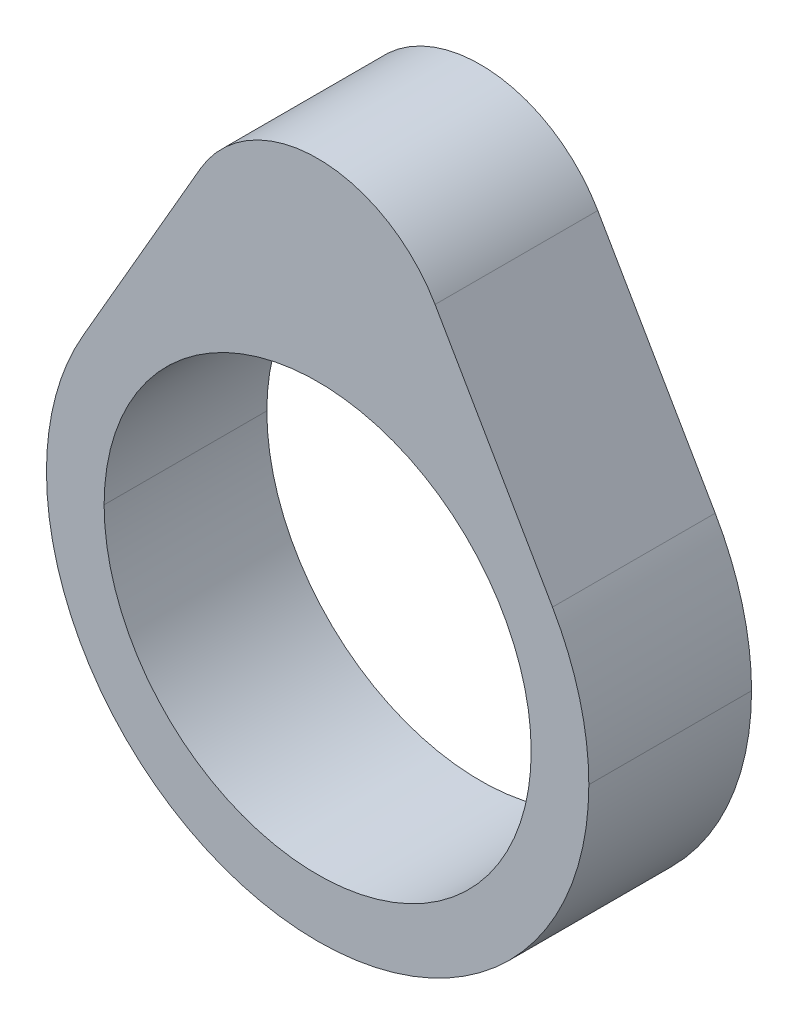
ISO-10303-21;
HEADER;
FILE_DESCRIPTION(('STEP AP214'),'2;1');
FILE_NAME('part.step','',(''),(''),'','','');
FILE_SCHEMA(('AUTOMOTIVE_DESIGN { 1 0 10303 214 1 1 1 1 }'));
ENDSEC;
DATA;
#1=APPLICATION_CONTEXT('core data for automotive mechanical design processes');
#2=APPLICATION_PROTOCOL_DEFINITION('international standard','automotive_design',2000,#1);
#3=PRODUCT_CONTEXT('',#1,'mechanical');
#4=PRODUCT('Part','Part','',(#3));
#5=PRODUCT_RELATED_PRODUCT_CATEGORY('part','',(#4));
#6=PRODUCT_DEFINITION_FORMATION('','',#4);
#7=PRODUCT_DEFINITION_CONTEXT('part definition',#1,'design');
#8=PRODUCT_DEFINITION('design','',#6,#7);
#9=PRODUCT_DEFINITION_SHAPE('','',#8);
#10=(LENGTH_UNIT() NAMED_UNIT(*) SI_UNIT(.MILLI.,.METRE.));
#11=(NAMED_UNIT(*) PLANE_ANGLE_UNIT() SI_UNIT($,.RADIAN.));
#12=(NAMED_UNIT(*) SI_UNIT($,.STERADIAN.) SOLID_ANGLE_UNIT());
#13=UNCERTAINTY_MEASURE_WITH_UNIT(LENGTH_MEASURE(1.E-05),#10,'distance_accuracy_value','');
#14=(GEOMETRIC_REPRESENTATION_CONTEXT(3) GLOBAL_UNCERTAINTY_ASSIGNED_CONTEXT((#13)) GLOBAL_UNIT_ASSIGNED_CONTEXT((#10,
#11,#12)) REPRESENTATION_CONTEXT('',''));
#15=CARTESIAN_POINT('',(0.,0.,0.));
#16=DIRECTION('',(0.,0.,1.));
#17=DIRECTION('',(1.,0.,0.));
#18=AXIS2_PLACEMENT_3D('',#15,#16,#17);
#19=CARTESIAN_POINT('',(0.,-12.7,10.));
#20=DIRECTION('',(0.,0.,-1.));
#21=DIRECTION('',(-1.,0.,0.));
#22=AXIS2_PLACEMENT_3D('',#19,#20,#21);
#23=CYLINDRICAL_SURFACE('',#22,10.);
#24=DIRECTION('',(0.,0.,-1.));
#25=VECTOR('',#24,1.);
#26=CARTESIAN_POINT('',(10.,-12.7,10.));
#27=LINE('',#26,#25);
#28=CARTESIAN_POINT('',(10.,-12.7,7.62));
#29=VERTEX_POINT('',#28);
#30=CARTESIAN_POINT('',(10.,-12.7,0.));
#31=VERTEX_POINT('',#30);
#32=EDGE_CURVE('E134',#29,#31,#27,.T.);
#33=ORIENTED_EDGE('',*,*,#32,.F.);
#34=CARTESIAN_POINT('',(0.,-12.7,7.62));
#35=DIRECTION('',(0.,0.,1.));
#36=DIRECTION('',(1.,0.,0.));
#37=AXIS2_PLACEMENT_3D('',#34,#35,#36);
#38=CIRCLE('',#37,10.);
#39=CARTESIAN_POINT('',(-10.,-12.7,7.62));
#40=VERTEX_POINT('',#39);
#41=EDGE_CURVE('E28',#29,#40,#38,.T.);
#42=ORIENTED_EDGE('',*,*,#41,.T.);
#43=DIRECTION('',(0.,0.,-1.));
#44=VECTOR('',#43,1.);
#45=CARTESIAN_POINT('',(-10.,-12.7,10.));
#46=LINE('',#45,#44);
#47=CARTESIAN_POINT('',(-10.,-12.7,0.));
#48=VERTEX_POINT('',#47);
#49=EDGE_CURVE('E141',#40,#48,#46,.T.);
#50=ORIENTED_EDGE('',*,*,#49,.T.);
#51=CARTESIAN_POINT('',(0.,-12.7,0.));
#52=DIRECTION('',(0.,0.,-1.));
#53=DIRECTION('',(-1.,0.,0.));
#54=AXIS2_PLACEMENT_3D('',#51,#52,#53);
#55=CIRCLE('',#54,10.);
#56=EDGE_CURVE('E11',#48,#31,#55,.T.);
#57=ORIENTED_EDGE('',*,*,#56,.T.);
#58=EDGE_LOOP('',(#33,#42,#50,#57));
#59=FACE_BOUND('',#58,.T.);
#60=ADVANCED_FACE('F17',(#59),#23,.F.);
#61=CARTESIAN_POINT('',(0.,0.,0.));
#62=DIRECTION('',(0.,0.,1.));
#63=DIRECTION('',(1.,0.,0.));
#64=AXIS2_PLACEMENT_3D('',#61,#62,#63);
#65=PLANE('',#64);
#66=ORIENTED_EDGE('',*,*,#56,.F.);
#67=CARTESIAN_POINT('',(0.,-12.7,0.));
#68=DIRECTION('',(0.,0.,-1.));
#69=DIRECTION('',(-1.,0.,0.));
#70=AXIS2_PLACEMENT_3D('',#67,#68,#69);
#71=CIRCLE('',#70,10.);
#72=EDGE_CURVE('E138',#31,#48,#71,.T.);
#73=ORIENTED_EDGE('',*,*,#72,.F.);
#74=EDGE_LOOP('',(#66,#73));
#75=FACE_BOUND('',#74,.T.);
#76=CARTESIAN_POINT('',(0.,0.,0.));
#77=DIRECTION('',(0.,0.,1.));
#78=DIRECTION('',(1.,0.,0.));
#79=AXIS2_PLACEMENT_3D('',#76,#77,#78);
#80=CIRCLE('',#79,6.35);
#81=CARTESIAN_POINT('',(5.49926131403119,3.175,0.));
#82=VERTEX_POINT('',#81);
#83=CARTESIAN_POINT('',(-5.49926131403119,3.175,0.));
#84=VERTEX_POINT('',#83);
#85=EDGE_CURVE('E150',#82,#84,#80,.T.);
#86=ORIENTED_EDGE('',*,*,#85,.F.);
#87=DIRECTION('',(-0.5,0.866025403784439,0.));
#88=VECTOR('',#87,1.);
#89=CARTESIAN_POINT('',(5.49926131403119,3.175,0.));
#90=LINE('',#89,#88);
#91=CARTESIAN_POINT('',(10.9985226280624,-6.35,0.));
#92=VERTEX_POINT('',#91);
#93=EDGE_CURVE('E21',#92,#82,#90,.T.);
#94=ORIENTED_EDGE('',*,*,#93,.F.);
#95=CARTESIAN_POINT('',(0.,-12.7,0.));
#96=DIRECTION('',(0.,0.,1.));
#97=DIRECTION('',(1.,0.,0.));
#98=AXIS2_PLACEMENT_3D('',#95,#96,#97);
#99=CIRCLE('',#98,12.7);
#100=CARTESIAN_POINT('',(12.7,-12.7,0.));
#101=VERTEX_POINT('',#100);
#102=EDGE_CURVE('E182',#101,#92,#99,.T.);
#103=ORIENTED_EDGE('',*,*,#102,.F.);
#104=CARTESIAN_POINT('',(0.,-12.7,0.));
#105=DIRECTION('',(0.,0.,1.));
#106=DIRECTION('',(1.,0.,0.));
#107=AXIS2_PLACEMENT_3D('',#104,#105,#106);
#108=CIRCLE('',#107,12.7);
#109=CARTESIAN_POINT('',(-12.7,-12.7,0.));
#110=VERTEX_POINT('',#109);
#111=EDGE_CURVE('E155',#110,#101,#108,.T.);
#112=ORIENTED_EDGE('',*,*,#111,.F.);
#113=CARTESIAN_POINT('',(0.,-12.7,0.));
#114=DIRECTION('',(0.,0.,1.));
#115=DIRECTION('',(1.,0.,0.));
#116=AXIS2_PLACEMENT_3D('',#113,#114,#115);
#117=CIRCLE('',#116,12.7);
#118=CARTESIAN_POINT('',(-10.9985226280624,-6.35,0.));
#119=VERTEX_POINT('',#118);
#120=EDGE_CURVE('E84',#119,#110,#117,.T.);
#121=ORIENTED_EDGE('',*,*,#120,.F.);
#122=DIRECTION('',(-0.5,-0.866025403784439,0.));
#123=VECTOR('',#122,1.);
#124=CARTESIAN_POINT('',(-5.49926131403119,3.175,0.));
#125=LINE('',#124,#123);
#126=EDGE_CURVE('E164',#84,#119,#125,.T.);
#127=ORIENTED_EDGE('',*,*,#126,.F.);
#128=EDGE_LOOP('',(#86,#94,#103,#112,#121,#127));
#129=FACE_BOUND('',#128,.T.);
#130=ADVANCED_FACE('F204',(#75,#129),#65,.F.);
#131=CARTESIAN_POINT('',(0.,0.,7.62));
#132=DIRECTION('',(0.,0.,1.));
#133=DIRECTION('',(1.,0.,0.));
#134=AXIS2_PLACEMENT_3D('',#131,#132,#133);
#135=PLANE('',#134);
#136=CARTESIAN_POINT('',(0.,-12.7,7.62));
#137=DIRECTION('',(0.,0.,1.));
#138=DIRECTION('',(1.,0.,0.));
#139=AXIS2_PLACEMENT_3D('',#136,#137,#138);
#140=CIRCLE('',#139,10.);
#141=EDGE_CURVE('E129',#40,#29,#140,.T.);
#142=ORIENTED_EDGE('',*,*,#141,.F.);
#143=ORIENTED_EDGE('',*,*,#41,.F.);
#144=EDGE_LOOP('',(#142,#143));
#145=FACE_BOUND('',#144,.T.);
#146=CARTESIAN_POINT('',(0.,0.,7.62));
#147=DIRECTION('',(0.,0.,1.));
#148=DIRECTION('',(1.,0.,0.));
#149=AXIS2_PLACEMENT_3D('',#146,#147,#148);
#150=CIRCLE('',#149,6.35);
#151=CARTESIAN_POINT('',(5.49926131403119,3.175,7.62));
#152=VERTEX_POINT('',#151);
#153=CARTESIAN_POINT('',(-5.49926131403119,3.175,7.62));
#154=VERTEX_POINT('',#153);
#155=EDGE_CURVE('E165',#152,#154,#150,.T.);
#156=ORIENTED_EDGE('',*,*,#155,.T.);
#157=DIRECTION('',(-0.5,-0.866025403784439,0.));
#158=VECTOR('',#157,1.);
#159=CARTESIAN_POINT('',(-5.49926131403119,3.175,7.62));
#160=LINE('',#159,#158);
#161=CARTESIAN_POINT('',(-10.9985226280624,-6.35,7.62));
#162=VERTEX_POINT('',#161);
#163=EDGE_CURVE('E94',#154,#162,#160,.T.);
#164=ORIENTED_EDGE('',*,*,#163,.T.);
#165=CARTESIAN_POINT('',(0.,-12.7,7.62));
#166=DIRECTION('',(0.,0.,1.));
#167=DIRECTION('',(1.,0.,0.));
#168=AXIS2_PLACEMENT_3D('',#165,#166,#167);
#169=CIRCLE('',#168,12.7);
#170=CARTESIAN_POINT('',(-12.7,-12.7,7.62));
#171=VERTEX_POINT('',#170);
#172=EDGE_CURVE('E43',#162,#171,#169,.T.);
#173=ORIENTED_EDGE('',*,*,#172,.T.);
#174=CARTESIAN_POINT('',(0.,-12.7,7.62));
#175=DIRECTION('',(0.,0.,1.));
#176=DIRECTION('',(1.,0.,0.));
#177=AXIS2_PLACEMENT_3D('',#174,#175,#176);
#178=CIRCLE('',#177,12.7);
#179=CARTESIAN_POINT('',(12.7,-12.7,7.62));
#180=VERTEX_POINT('',#179);
#181=EDGE_CURVE('E170',#171,#180,#178,.T.);
#182=ORIENTED_EDGE('',*,*,#181,.T.);
#183=CARTESIAN_POINT('',(0.,-12.7,7.62));
#184=DIRECTION('',(0.,0.,1.));
#185=DIRECTION('',(1.,0.,0.));
#186=AXIS2_PLACEMENT_3D('',#183,#184,#185);
#187=CIRCLE('',#186,12.7);
#188=CARTESIAN_POINT('',(10.9985226280624,-6.35,7.62));
#189=VERTEX_POINT('',#188);
#190=EDGE_CURVE('E160',#180,#189,#187,.T.);
#191=ORIENTED_EDGE('',*,*,#190,.T.);
#192=DIRECTION('',(-0.5,0.866025403784439,0.));
#193=VECTOR('',#192,1.);
#194=CARTESIAN_POINT('',(5.49926131403119,3.175,7.62));
#195=LINE('',#194,#193);
#196=EDGE_CURVE('E105',#189,#152,#195,.T.);
#197=ORIENTED_EDGE('',*,*,#196,.T.);
#198=EDGE_LOOP('',(#156,#164,#173,#182,#191,#197));
#199=FACE_BOUND('',#198,.T.);
#200=ADVANCED_FACE('F127',(#145,#199),#135,.T.);
#201=CARTESIAN_POINT('',(5.49926131403119,3.175,7.62));
#202=DIRECTION('',(-0.866025403784439,-0.5,0.));
#203=DIRECTION('',(-0.5,0.866025403784439,0.));
#204=AXIS2_PLACEMENT_3D('',#201,#202,#203);
#205=PLANE('',#204);
#206=ORIENTED_EDGE('',*,*,#93,.T.);
#207=DIRECTION('',(0.,0.,-1.));
#208=VECTOR('',#207,1.);
#209=CARTESIAN_POINT('',(5.49926131403119,3.175,7.62));
#210=LINE('',#209,#208);
#211=EDGE_CURVE('E161',#152,#82,#210,.T.);
#212=ORIENTED_EDGE('',*,*,#211,.F.);
#213=ORIENTED_EDGE('',*,*,#196,.F.);
#214=DIRECTION('',(0.,0.,-1.));
#215=VECTOR('',#214,1.);
#216=CARTESIAN_POINT('',(10.9985226280624,-6.35,7.62));
#217=LINE('',#216,#215);
#218=EDGE_CURVE('E174',#189,#92,#217,.T.);
#219=ORIENTED_EDGE('',*,*,#218,.T.);
#220=EDGE_LOOP('',(#206,#212,#213,#219));
#221=FACE_BOUND('',#220,.T.);
#222=ADVANCED_FACE('F208',(#221),#205,.F.);
#223=CARTESIAN_POINT('',(0.,-12.7,7.62));
#224=DIRECTION('',(0.,0.,-1.));
#225=DIRECTION('',(-1.,0.,0.));
#226=AXIS2_PLACEMENT_3D('',#223,#224,#225);
#227=CYLINDRICAL_SURFACE('',#226,12.7);
#228=DIRECTION('',(0.,0.,-1.));
#229=VECTOR('',#228,1.);
#230=CARTESIAN_POINT('',(-12.7,-12.7,7.62));
#231=LINE('',#230,#229);
#232=EDGE_CURVE('E173',#171,#110,#231,.T.);
#233=ORIENTED_EDGE('',*,*,#232,.F.);
#234=ORIENTED_EDGE('',*,*,#172,.F.);
#235=DIRECTION('',(0.,0.,-1.));
#236=VECTOR('',#235,1.);
#237=CARTESIAN_POINT('',(-10.9985226280624,-6.35,7.62));
#238=LINE('',#237,#236);
#239=EDGE_CURVE('E166',#162,#119,#238,.T.);
#240=ORIENTED_EDGE('',*,*,#239,.T.);
#241=ORIENTED_EDGE('',*,*,#120,.T.);
#242=EDGE_LOOP('',(#233,#234,#240,#241));
#243=FACE_BOUND('',#242,.T.);
#244=ADVANCED_FACE('F19',(#243),#227,.T.);
#245=CARTESIAN_POINT('',(-5.49926131403119,3.175,7.62));
#246=DIRECTION('',(0.866025403784439,-0.5,0.));
#247=DIRECTION('',(0.,0.,-1.));
#248=AXIS2_PLACEMENT_3D('',#245,#246,#247);
#249=PLANE('',#248);
#250=ORIENTED_EDGE('',*,*,#126,.T.);
#251=ORIENTED_EDGE('',*,*,#239,.F.);
#252=ORIENTED_EDGE('',*,*,#163,.F.);
#253=DIRECTION('',(0.,0.,-1.));
#254=VECTOR('',#253,1.);
#255=CARTESIAN_POINT('',(-5.49926131403119,3.175,7.62));
#256=LINE('',#255,#254);
#257=EDGE_CURVE('E154',#154,#84,#256,.T.);
#258=ORIENTED_EDGE('',*,*,#257,.T.);
#259=EDGE_LOOP('',(#250,#251,#252,#258));
#260=FACE_BOUND('',#259,.T.);
#261=ADVANCED_FACE('F200',(#260),#249,.F.);
#262=CARTESIAN_POINT('',(0.,0.,7.62));
#263=DIRECTION('',(0.,0.,-1.));
#264=DIRECTION('',(-1.,0.,0.));
#265=AXIS2_PLACEMENT_3D('',#262,#263,#264);
#266=CYLINDRICAL_SURFACE('',#265,6.35);
#267=ORIENTED_EDGE('',*,*,#85,.T.);
#268=ORIENTED_EDGE('',*,*,#257,.F.);
#269=ORIENTED_EDGE('',*,*,#155,.F.);
#270=ORIENTED_EDGE('',*,*,#211,.T.);
#271=EDGE_LOOP('',(#267,#268,#269,#270));
#272=FACE_BOUND('',#271,.T.);
#273=ADVANCED_FACE('F214',(#272),#266,.T.);
#274=CARTESIAN_POINT('',(0.,-12.7,7.62));
#275=DIRECTION('',(0.,0.,-1.));
#276=DIRECTION('',(-1.,0.,0.));
#277=AXIS2_PLACEMENT_3D('',#274,#275,#276);
#278=CYLINDRICAL_SURFACE('',#277,12.7);
#279=DIRECTION('',(0.,0.,-1.));
#280=VECTOR('',#279,1.);
#281=CARTESIAN_POINT('',(12.7,-12.7,7.62));
#282=LINE('',#281,#280);
#283=EDGE_CURVE('E147',#180,#101,#282,.T.);
#284=ORIENTED_EDGE('',*,*,#283,.F.);
#285=ORIENTED_EDGE('',*,*,#181,.F.);
#286=ORIENTED_EDGE('',*,*,#232,.T.);
#287=ORIENTED_EDGE('',*,*,#111,.T.);
#288=EDGE_LOOP('',(#284,#285,#286,#287));
#289=FACE_BOUND('',#288,.T.);
#290=ADVANCED_FACE('F227',(#289),#278,.T.);
#291=CARTESIAN_POINT('',(0.,-12.7,7.62));
#292=DIRECTION('',(0.,0.,-1.));
#293=DIRECTION('',(-1.,0.,0.));
#294=AXIS2_PLACEMENT_3D('',#291,#292,#293);
#295=CYLINDRICAL_SURFACE('',#294,12.7);
#296=ORIENTED_EDGE('',*,*,#190,.F.);
#297=ORIENTED_EDGE('',*,*,#283,.T.);
#298=ORIENTED_EDGE('',*,*,#102,.T.);
#299=ORIENTED_EDGE('',*,*,#218,.F.);
#300=EDGE_LOOP('',(#296,#297,#298,#299));
#301=FACE_BOUND('',#300,.T.);
#302=ADVANCED_FACE('F230',(#301),#295,.T.);
#303=CARTESIAN_POINT('',(0.,-12.7,10.));
#304=DIRECTION('',(0.,0.,-1.));
#305=DIRECTION('',(-1.,0.,0.));
#306=AXIS2_PLACEMENT_3D('',#303,#304,#305);
#307=CYLINDRICAL_SURFACE('',#306,10.);
#308=ORIENTED_EDGE('',*,*,#141,.T.);
#309=ORIENTED_EDGE('',*,*,#32,.T.);
#310=ORIENTED_EDGE('',*,*,#72,.T.);
#311=ORIENTED_EDGE('',*,*,#49,.F.);
#312=EDGE_LOOP('',(#308,#309,#310,#311));
#313=FACE_BOUND('',#312,.T.);
#314=ADVANCED_FACE('F140',(#313),#307,.F.);
#315=CLOSED_SHELL('',(#60,#130,#200,#222,#244,#261,#273,#290,#302,#314));
#316=MANIFOLD_SOLID_BREP('B1',#315);
#317=ADVANCED_BREP_SHAPE_REPRESENTATION('',(#18,#316),#14);
#318=SHAPE_DEFINITION_REPRESENTATION(#9,#317);
ENDSEC;
END-ISO-10303-21;
